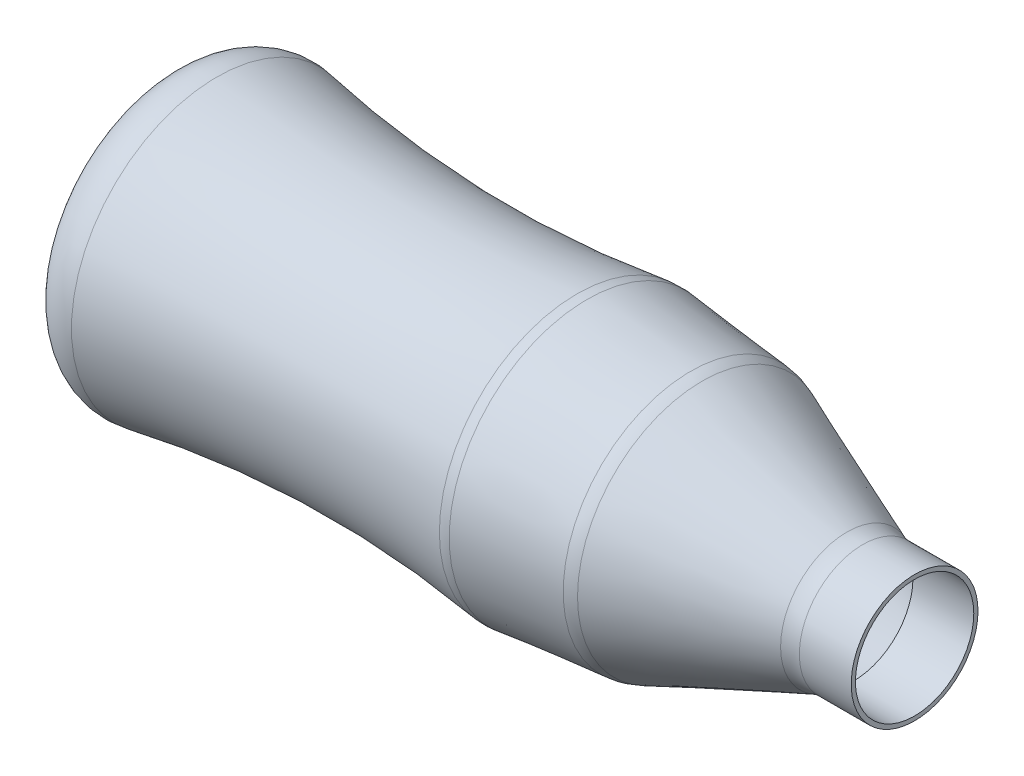
ISO-10303-21;
HEADER;
FILE_DESCRIPTION(('STEP AP214'),'2;1');
FILE_NAME('part.step','',(''),(''),'','','');
FILE_SCHEMA(('AUTOMOTIVE_DESIGN { 1 0 10303 214 1 1 1 1 }'));
ENDSEC;
DATA;
#1=APPLICATION_CONTEXT('core data for automotive mechanical design processes');
#2=APPLICATION_PROTOCOL_DEFINITION('international standard','automotive_design',2000,#1);
#3=PRODUCT_CONTEXT('',#1,'mechanical');
#4=PRODUCT('Part','Part','',(#3));
#5=PRODUCT_RELATED_PRODUCT_CATEGORY('part','',(#4));
#6=PRODUCT_DEFINITION_FORMATION('','',#4);
#7=PRODUCT_DEFINITION_CONTEXT('part definition',#1,'design');
#8=PRODUCT_DEFINITION('design','',#6,#7);
#9=PRODUCT_DEFINITION_SHAPE('','',#8);
#10=(LENGTH_UNIT() NAMED_UNIT(*) SI_UNIT(.MILLI.,.METRE.));
#11=(NAMED_UNIT(*) PLANE_ANGLE_UNIT() SI_UNIT($,.RADIAN.));
#12=(NAMED_UNIT(*) SI_UNIT($,.STERADIAN.) SOLID_ANGLE_UNIT());
#13=UNCERTAINTY_MEASURE_WITH_UNIT(LENGTH_MEASURE(1.E-05),#10,'distance_accuracy_value','');
#14=(GEOMETRIC_REPRESENTATION_CONTEXT(3) GLOBAL_UNCERTAINTY_ASSIGNED_CONTEXT((#13)) GLOBAL_UNIT_ASSIGNED_CONTEXT((#10,
#11,#12)) REPRESENTATION_CONTEXT('',''));
#15=CARTESIAN_POINT('',(0.,0.,0.));
#16=DIRECTION('',(0.,0.,1.));
#17=DIRECTION('',(1.,0.,0.));
#18=AXIS2_PLACEMENT_3D('',#15,#16,#17);
#19=CARTESIAN_POINT('',(26.1518934911242,0.,0.));
#20=DIRECTION('',(-1.,0.,0.));
#21=DIRECTION('',(0.,0.,1.));
#22=AXIS2_PLACEMENT_3D('',#19,#20,#21);
#23=CONICAL_SURFACE('',#22,32.75,0.101166915576167);
#24=CARTESIAN_POINT('',(51.8380863619381,0.,0.));
#25=DIRECTION('',(1.,0.,0.));
#26=DIRECTION('',(0.,0.,-1.));
#27=AXIS2_PLACEMENT_3D('',#24,#25,#26);
#28=CIRCLE('',#27,30.1425053379573);
#29=CARTESIAN_POINT('',(51.8380863619381,0.,-30.1425053379573));
#30=VERTEX_POINT('',#29);
#31=EDGE_CURVE('E45',#30,#30,#28,.F.);
#32=ORIENTED_EDGE('',*,*,#31,.T.);
#33=EDGE_LOOP('',(#32));
#34=FACE_BOUND('',#33,.T.);
#35=CARTESIAN_POINT('',(27.3486874518526,0.,0.));
#36=DIRECTION('',(1.,0.,0.));
#37=DIRECTION('',(0.,0.,-1.));
#38=AXIS2_PLACEMENT_3D('',#35,#36,#37);
#39=CIRCLE('',#38,32.6285092878552);
#40=CARTESIAN_POINT('',(27.3486874518526,0.,-32.6285092878552));
#41=VERTEX_POINT('',#40);
#42=EDGE_CURVE('E50',#41,#41,#39,.T.);
#43=ORIENTED_EDGE('',*,*,#42,.T.);
#44=EDGE_LOOP('',(#43));
#45=FACE_BOUND('',#44,.T.);
#46=ADVANCED_FACE('F37',(#34,#45),#23,.T.);
#47=CARTESIAN_POINT('',(-11.8834115231901,0.,0.));
#48=DIRECTION('',(1.,0.,0.));
#49=DIRECTION('',(0.,0.,-1.));
#50=AXIS2_PLACEMENT_3D('',#47,#48,#49);
#51=TOROIDAL_SURFACE('',#50,301.74730515709,271.673028858789);
#52=CARTESIAN_POINT('',(24.981774187156,0.,0.));
#53=DIRECTION('',(-1.,0.,0.));
#54=DIRECTION('',(0.,0.,1.));
#55=AXIS2_PLACEMENT_3D('',#52,#53,#54);
#56=CIRCLE('',#55,32.5871433726049);
#57=CARTESIAN_POINT('',(24.981774187156,0.,32.5871433726049));
#58=VERTEX_POINT('',#57);
#59=EDGE_CURVE('E10',#58,#58,#56,.T.);
#60=ORIENTED_EDGE('',*,*,#59,.T.);
#61=EDGE_LOOP('',(#60));
#62=FACE_BOUND('',#61,.T.);
#63=CARTESIAN_POINT('',(-60.2281065088757,0.,0.));
#64=DIRECTION('',(1.,0.,0.));
#65=DIRECTION('',(0.,0.,-1.));
#66=AXIS2_PLACEMENT_3D('',#63,#64,#65);
#67=CIRCLE('',#66,34.4103921128014);
#68=CARTESIAN_POINT('',(-60.2281065088757,0.,-34.4103921128014));
#69=VERTEX_POINT('',#68);
#70=EDGE_CURVE('E69',#69,#69,#67,.T.);
#71=ORIENTED_EDGE('',*,*,#70,.T.);
#72=EDGE_LOOP('',(#71));
#73=FACE_BOUND('',#72,.T.);
#74=ADVANCED_FACE('F124',(#62,#73),#51,.F.);
#75=CARTESIAN_POINT('',(-62.0076241587788,0.,0.));
#76=DIRECTION('',(1.,0.,0.));
#77=DIRECTION('',(0.,0.,-1.));
#78=AXIS2_PLACEMENT_3D('',#75,#76,#77);
#79=TOROIDAL_SURFACE('',#78,24.57,10.);
#80=ORIENTED_EDGE('',*,*,#70,.F.);
#81=EDGE_LOOP('',(#80));
#82=FACE_BOUND('',#81,.T.);
#83=CARTESIAN_POINT('',(-72.0076241587788,0.,0.));
#84=DIRECTION('',(1.,0.,0.));
#85=DIRECTION('',(0.,0.,-1.));
#86=AXIS2_PLACEMENT_3D('',#83,#84,#85);
#87=CIRCLE('',#86,24.57);
#88=CARTESIAN_POINT('',(-72.0076241587788,0.,-24.57));
#89=VERTEX_POINT('',#88);
#90=EDGE_CURVE('E73',#89,#89,#87,.T.);
#91=ORIENTED_EDGE('',*,*,#90,.T.);
#92=EDGE_LOOP('',(#91));
#93=FACE_BOUND('',#92,.T.);
#94=ADVANCED_FACE('F129',(#82,#93),#79,.T.);
#95=CARTESIAN_POINT('',(-72.0076241587788,0.,0.));
#96=DIRECTION('',(1.,0.,0.));
#97=DIRECTION('',(0.,0.,-1.));
#98=AXIS2_PLACEMENT_3D('',#95,#96,#97);
#99=PLANE('',#98);
#100=ORIENTED_EDGE('',*,*,#90,.F.);
#101=EDGE_LOOP('',(#100));
#102=FACE_BOUND('',#101,.T.);
#103=ADVANCED_FACE('F248',(#102),#99,.F.);
#104=CARTESIAN_POINT('',(-71.0076241587788,0.,0.));
#105=DIRECTION('',(1.,0.,0.));
#106=DIRECTION('',(0.,0.,-1.));
#107=AXIS2_PLACEMENT_3D('',#104,#105,#106);
#108=PLANE('',#107);
#109=CARTESIAN_POINT('',(-71.0076241587788,0.,0.));
#110=DIRECTION('',(1.,0.,0.));
#111=DIRECTION('',(0.,0.,-1.));
#112=AXIS2_PLACEMENT_3D('',#109,#110,#111);
#113=CIRCLE('',#112,24.57);
#114=CARTESIAN_POINT('',(-71.0076241587788,0.,-24.57));
#115=VERTEX_POINT('',#114);
#116=EDGE_CURVE('E77',#115,#115,#113,.T.);
#117=ORIENTED_EDGE('',*,*,#116,.T.);
#118=EDGE_LOOP('',(#117));
#119=FACE_BOUND('',#118,.T.);
#120=ADVANCED_FACE('F238',(#119),#108,.T.);
#121=CARTESIAN_POINT('',(-62.0076241587788,0.,0.));
#122=DIRECTION('',(1.,0.,0.));
#123=DIRECTION('',(0.,0.,-1.));
#124=AXIS2_PLACEMENT_3D('',#121,#122,#123);
#125=TOROIDAL_SURFACE('',#124,24.57,9.);
#126=CARTESIAN_POINT('',(-60.406058273866,0.,0.));
#127=DIRECTION('',(1.,0.,0.));
#128=DIRECTION('',(0.,0.,-1.));
#129=AXIS2_PLACEMENT_3D('',#126,#127,#128);
#130=CIRCLE('',#129,33.4263529015212);
#131=CARTESIAN_POINT('',(-60.406058273866,0.,-33.4263529015212));
#132=VERTEX_POINT('',#131);
#133=EDGE_CURVE('E81',#132,#132,#130,.T.);
#134=ORIENTED_EDGE('',*,*,#133,.T.);
#135=EDGE_LOOP('',(#134));
#136=FACE_BOUND('',#135,.T.);
#137=ORIENTED_EDGE('',*,*,#116,.F.);
#138=EDGE_LOOP('',(#137));
#139=FACE_BOUND('',#138,.T.);
#140=ADVANCED_FACE('F228',(#136,#139),#125,.F.);
#141=CARTESIAN_POINT('',(-11.8834115231901,0.,0.));
#142=DIRECTION('',(1.,0.,0.));
#143=DIRECTION('',(0.,0.,-1.));
#144=AXIS2_PLACEMENT_3D('',#141,#142,#143);
#145=TOROIDAL_SURFACE('',#144,301.74730515709,272.67302885879);
#146=CARTESIAN_POINT('',(26.1715731803598,0.,0.));
#147=DIRECTION('',(1.,0.,0.));
#148=DIRECTION('',(0.,0.,-1.));
#149=AXIS2_PLACEMENT_3D('',#146,#147,#148);
#150=CIRCLE('',#149,31.7428629598573);
#151=CARTESIAN_POINT('',(26.1715731803598,0.,-31.7428629598573));
#152=VERTEX_POINT('',#151);
#153=EDGE_CURVE('E85',#152,#152,#150,.T.);
#154=ORIENTED_EDGE('',*,*,#153,.T.);
#155=EDGE_LOOP('',(#154));
#156=FACE_BOUND('',#155,.T.);
#157=ORIENTED_EDGE('',*,*,#133,.F.);
#158=EDGE_LOOP('',(#157));
#159=FACE_BOUND('',#158,.T.);
#160=ADVANCED_FACE('F218',(#156,#159),#145,.T.);
#161=CARTESIAN_POINT('',(26.1715731803598,0.,0.));
#162=DIRECTION('',(-1.,0.,0.));
#163=DIRECTION('',(0.,0.,1.));
#164=AXIS2_PLACEMENT_3D('',#161,#162,#163);
#165=CONICAL_SURFACE('',#164,31.7428629598573,0.101166915576165);
#166=CARTESIAN_POINT('',(53.0005183439347,0.,0.));
#167=DIRECTION('',(1.,0.,0.));
#168=DIRECTION('',(0.,0.,-1.));
#169=AXIS2_PLACEMENT_3D('',#166,#167,#168);
#170=CIRCLE('',#169,29.0193635431047);
#171=CARTESIAN_POINT('',(53.0005183439347,0.,-29.0193635431047));
#172=VERTEX_POINT('',#171);
#173=EDGE_CURVE('E89',#172,#172,#170,.T.);
#174=ORIENTED_EDGE('',*,*,#173,.T.);
#175=EDGE_LOOP('',(#174));
#176=FACE_BOUND('',#175,.T.);
#177=ORIENTED_EDGE('',*,*,#153,.F.);
#178=EDGE_LOOP('',(#177));
#179=FACE_BOUND('',#178,.T.);
#180=ADVANCED_FACE('F208',(#176,#179),#165,.F.);
#181=CARTESIAN_POINT('',(53.0005183439347,0.,0.));
#182=DIRECTION('',(-1.,0.,0.));
#183=DIRECTION('',(0.,0.,1.));
#184=AXIS2_PLACEMENT_3D('',#181,#182,#183);
#185=CONICAL_SURFACE('',#184,29.0193635431047,0.381520435303608);
#186=CARTESIAN_POINT('',(90.4387852023803,0.,0.));
#187=DIRECTION('',(1.,0.,0.));
#188=DIRECTION('',(0.,0.,-1.));
#189=AXIS2_PLACEMENT_3D('',#186,#187,#188);
#190=CIRCLE('',#189,14.);
#191=CARTESIAN_POINT('',(90.4387852023803,0.,-14.));
#192=VERTEX_POINT('',#191);
#193=EDGE_CURVE('E93',#192,#192,#190,.T.);
#194=ORIENTED_EDGE('',*,*,#193,.T.);
#195=EDGE_LOOP('',(#194));
#196=FACE_BOUND('',#195,.T.);
#197=ORIENTED_EDGE('',*,*,#173,.F.);
#198=EDGE_LOOP('',(#197));
#199=FACE_BOUND('',#198,.T.);
#200=ADVANCED_FACE('F197',(#196,#199),#185,.F.);
#201=CARTESIAN_POINT('',(0.,0.,0.));
#202=DIRECTION('',(1.,0.,0.));
#203=DIRECTION('',(0.,0.,-1.));
#204=AXIS2_PLACEMENT_3D('',#201,#202,#203);
#205=CYLINDRICAL_SURFACE('',#204,14.);
#206=CARTESIAN_POINT('',(104.821893491124,0.,0.));
#207=DIRECTION('',(1.,0.,0.));
#208=DIRECTION('',(0.,0.,-1.));
#209=AXIS2_PLACEMENT_3D('',#206,#207,#208);
#210=CIRCLE('',#209,14.);
#211=CARTESIAN_POINT('',(104.821893491124,0.,-14.));
#212=VERTEX_POINT('',#211);
#213=EDGE_CURVE('E97',#212,#212,#210,.T.);
#214=ORIENTED_EDGE('',*,*,#213,.T.);
#215=EDGE_LOOP('',(#214));
#216=FACE_BOUND('',#215,.T.);
#217=ORIENTED_EDGE('',*,*,#193,.F.);
#218=EDGE_LOOP('',(#217));
#219=FACE_BOUND('',#218,.T.);
#220=ADVANCED_FACE('F121',(#216,#219),#205,.F.);
#221=CARTESIAN_POINT('',(104.821893491124,14.,0.));
#222=DIRECTION('',(1.,0.,0.));
#223=DIRECTION('',(0.,0.,-1.));
#224=AXIS2_PLACEMENT_3D('',#221,#222,#223);
#225=PLANE('',#224);
#226=CARTESIAN_POINT('',(104.821893491124,0.,0.));
#227=DIRECTION('',(1.,0.,0.));
#228=DIRECTION('',(0.,0.,-1.));
#229=AXIS2_PLACEMENT_3D('',#226,#227,#228);
#230=CIRCLE('',#229,15.);
#231=CARTESIAN_POINT('',(104.821893491124,0.,-15.));
#232=VERTEX_POINT('',#231);
#233=EDGE_CURVE('E101',#232,#232,#230,.T.);
#234=ORIENTED_EDGE('',*,*,#233,.T.);
#235=EDGE_LOOP('',(#234));
#236=FACE_BOUND('',#235,.T.);
#237=ORIENTED_EDGE('',*,*,#213,.F.);
#238=EDGE_LOOP('',(#237));
#239=FACE_BOUND('',#238,.T.);
#240=ADVANCED_FACE('F106',(#236,#239),#225,.T.);
#241=CARTESIAN_POINT('',(0.,0.,0.));
#242=DIRECTION('',(1.,0.,0.));
#243=DIRECTION('',(0.,0.,-1.));
#244=AXIS2_PLACEMENT_3D('',#241,#242,#243);
#245=CYLINDRICAL_SURFACE('',#244,15.);
#246=CARTESIAN_POINT('',(92.5629763785642,0.,0.));
#247=DIRECTION('',(1.,0.,0.));
#248=DIRECTION('',(0.,0.,-1.));
#249=AXIS2_PLACEMENT_3D('',#246,#247,#248);
#250=CIRCLE('',#249,15.);
#251=CARTESIAN_POINT('',(92.5629763785642,0.,-15.));
#252=VERTEX_POINT('',#251);
#253=EDGE_CURVE('E65',#252,#252,#250,.T.);
#254=ORIENTED_EDGE('',*,*,#253,.T.);
#255=EDGE_LOOP('',(#254));
#256=FACE_BOUND('',#255,.T.);
#257=ORIENTED_EDGE('',*,*,#233,.F.);
#258=EDGE_LOOP('',(#257));
#259=FACE_BOUND('',#258,.T.);
#260=ADVANCED_FACE('F109',(#256,#259),#245,.T.);
#261=CARTESIAN_POINT('',(53.2418934911243,0.,0.));
#262=DIRECTION('',(-1.,0.,0.));
#263=DIRECTION('',(0.,0.,1.));
#264=AXIS2_PLACEMENT_3D('',#261,#262,#263);
#265=CONICAL_SURFACE('',#264,30.,0.381520435303609);
#266=CARTESIAN_POINT('',(88.8396562322301,0.,0.));
#267=DIRECTION('',(-1.,0.,0.));
#268=DIRECTION('',(0.,0.,1.));
#269=AXIS2_PLACEMENT_3D('',#266,#267,#268);
#270=CIRCLE('',#269,15.7190039819046);
#271=CARTESIAN_POINT('',(88.8396562322301,0.,15.7190039819046));
#272=VERTEX_POINT('',#271);
#273=EDGE_CURVE('E55',#272,#272,#270,.T.);
#274=ORIENTED_EDGE('',*,*,#273,.T.);
#275=EDGE_LOOP('',(#274));
#276=FACE_BOUND('',#275,.T.);
#277=CARTESIAN_POINT('',(54.5514621655625,0.,0.));
#278=DIRECTION('',(1.,0.,0.));
#279=DIRECTION('',(0.,0.,-1.));
#280=AXIS2_PLACEMENT_3D('',#277,#278,#279);
#281=CIRCLE('',#280,29.4746314491422);
#282=CARTESIAN_POINT('',(54.5514621655625,0.,-29.4746314491422));
#283=VERTEX_POINT('',#282);
#284=EDGE_CURVE('E61',#283,#283,#281,.T.);
#285=ORIENTED_EDGE('',*,*,#284,.T.);
#286=EDGE_LOOP('',(#285));
#287=FACE_BOUND('',#286,.T.);
#288=ADVANCED_FACE('F111',(#276,#287),#265,.T.);
#289=CARTESIAN_POINT('',(92.5629763785642,0.,0.));
#290=DIRECTION('',(1.,0.,0.));
#291=DIRECTION('',(0.,0.,-1.));
#292=AXIS2_PLACEMENT_3D('',#289,#290,#291);
#293=TOROIDAL_SURFACE('',#292,25.,10.);
#294=ORIENTED_EDGE('',*,*,#273,.F.);
#295=EDGE_LOOP('',(#294));
#296=FACE_BOUND('',#295,.T.);
#297=ORIENTED_EDGE('',*,*,#253,.F.);
#298=EDGE_LOOP('',(#297));
#299=FACE_BOUND('',#298,.T.);
#300=ADVANCED_FACE('F118',(#296,#299),#293,.F.);
#301=CARTESIAN_POINT('',(50.8281420192285,0.,0.));
#302=DIRECTION('',(-1.,0.,0.));
#303=DIRECTION('',(0.,0.,1.));
#304=AXIS2_PLACEMENT_3D('',#301,#302,#303);
#305=TOROIDAL_SURFACE('',#304,20.1936354310468,10.);
#306=ORIENTED_EDGE('',*,*,#31,.F.);
#307=EDGE_LOOP('',(#306));
#308=FACE_BOUND('',#307,.T.);
#309=ORIENTED_EDGE('',*,*,#284,.F.);
#310=EDGE_LOOP('',(#309));
#311=FACE_BOUND('',#310,.T.);
#312=ADVANCED_FACE('F135',(#308,#311),#305,.T.);
#313=CARTESIAN_POINT('',(26.338743109143,0.,0.));
#314=DIRECTION('',(-1.,0.,0.));
#315=DIRECTION('',(0.,0.,1.));
#316=AXIS2_PLACEMENT_3D('',#313,#314,#315);
#317=TOROIDAL_SURFACE('',#316,22.6796393809447,10.);
#318=ORIENTED_EDGE('',*,*,#59,.F.);
#319=EDGE_LOOP('',(#318));
#320=FACE_BOUND('',#319,.T.);
#321=ORIENTED_EDGE('',*,*,#42,.F.);
#322=EDGE_LOOP('',(#321));
#323=FACE_BOUND('',#322,.T.);
#324=ADVANCED_FACE('F39',(#320,#323),#317,.T.);
#325=CLOSED_SHELL('',(#46,#74,#94,#103,#120,#140,#160,#180,#200,#220,#240,#260,#288,#300,#312,#324));
#326=MANIFOLD_SOLID_BREP('B2',#325);
#327=ADVANCED_BREP_SHAPE_REPRESENTATION('',(#18,#326),#14);
#328=SHAPE_DEFINITION_REPRESENTATION(#9,#327);
ENDSEC;
END-ISO-10303-21;
